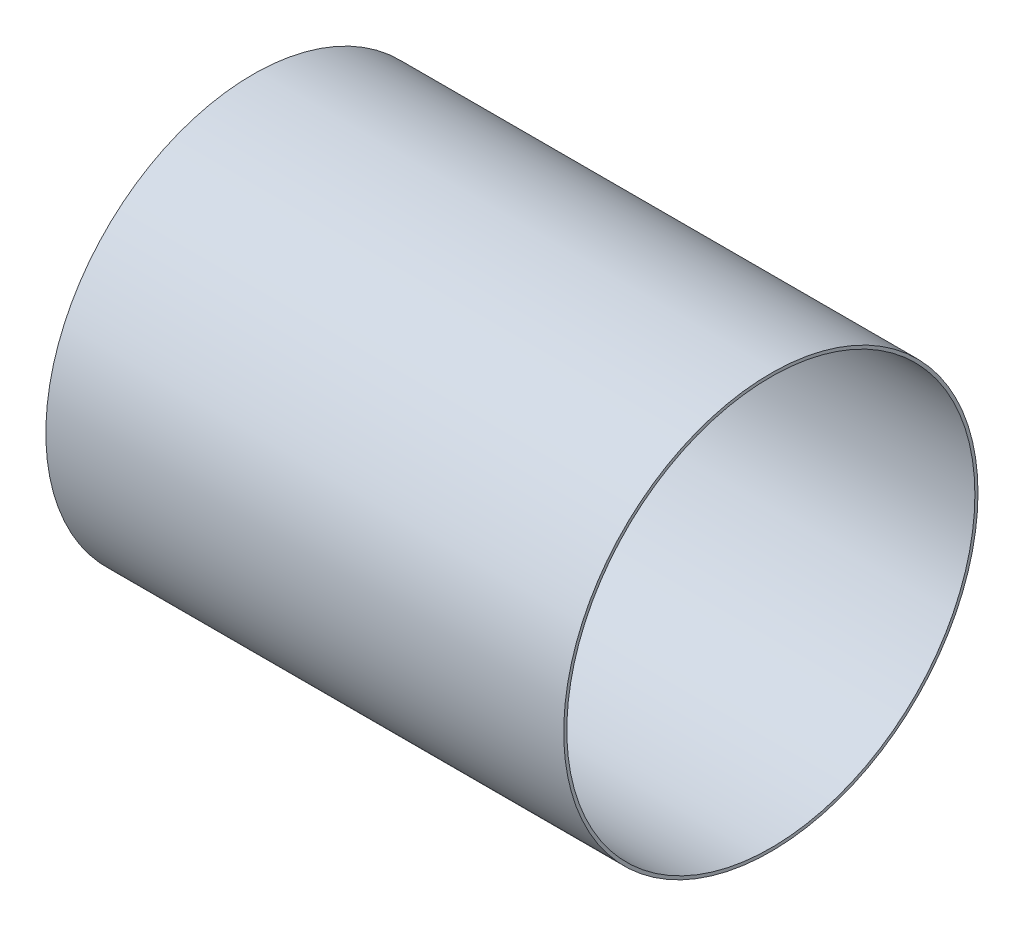
ISO-10303-21;
HEADER;
FILE_DESCRIPTION(('STEP AP214'),'2;1');
FILE_NAME('part.step','',(''),(''),'','','');
FILE_SCHEMA(('AUTOMOTIVE_DESIGN { 1 0 10303 214 1 1 1 1 }'));
ENDSEC;
DATA;
#1=APPLICATION_CONTEXT('core data for automotive mechanical design processes');
#2=APPLICATION_PROTOCOL_DEFINITION('international standard','automotive_design',2000,#1);
#3=PRODUCT_CONTEXT('',#1,'mechanical');
#4=PRODUCT('Part','Part','',(#3));
#5=PRODUCT_RELATED_PRODUCT_CATEGORY('part','',(#4));
#6=PRODUCT_DEFINITION_FORMATION('','',#4);
#7=PRODUCT_DEFINITION_CONTEXT('part definition',#1,'design');
#8=PRODUCT_DEFINITION('design','',#6,#7);
#9=PRODUCT_DEFINITION_SHAPE('','',#8);
#10=(LENGTH_UNIT() NAMED_UNIT(*) SI_UNIT(.MILLI.,.METRE.));
#11=(NAMED_UNIT(*) PLANE_ANGLE_UNIT() SI_UNIT($,.RADIAN.));
#12=(NAMED_UNIT(*) SI_UNIT($,.STERADIAN.) SOLID_ANGLE_UNIT());
#13=UNCERTAINTY_MEASURE_WITH_UNIT(LENGTH_MEASURE(1.E-05),#10,'distance_accuracy_value','');
#14=(GEOMETRIC_REPRESENTATION_CONTEXT(3) GLOBAL_UNCERTAINTY_ASSIGNED_CONTEXT((#13)) GLOBAL_UNIT_ASSIGNED_CONTEXT((#10,
#11,#12)) REPRESENTATION_CONTEXT('',''));
#15=CARTESIAN_POINT('',(0.,0.,0.));
#16=DIRECTION('',(0.,0.,1.));
#17=DIRECTION('',(1.,0.,0.));
#18=AXIS2_PLACEMENT_3D('',#15,#16,#17);
#19=CARTESIAN_POINT('',(500.,0.,0.));
#20=DIRECTION('',(1.,0.,0.));
#21=DIRECTION('',(0.,0.,-1.));
#22=AXIS2_PLACEMENT_3D('',#19,#20,#21);
#23=PLANE('',#22);
#24=CARTESIAN_POINT('',(500.,0.,0.));
#25=DIRECTION('',(1.,0.,0.));
#26=DIRECTION('',(0.,0.,-1.));
#27=AXIS2_PLACEMENT_3D('',#24,#25,#26);
#28=CIRCLE('',#27,200.);
#29=CARTESIAN_POINT('',(500.,0.,-200.));
#30=VERTEX_POINT('',#29);
#31=EDGE_CURVE('E10',#30,#30,#28,.T.);
#32=ORIENTED_EDGE('',*,*,#31,.T.);
#33=EDGE_LOOP('',(#32));
#34=FACE_BOUND('',#33,.T.);
#35=CARTESIAN_POINT('',(500.,0.,0.));
#36=DIRECTION('',(1.,0.,0.));
#37=DIRECTION('',(0.,0.,-1.));
#38=AXIS2_PLACEMENT_3D('',#35,#36,#37);
#39=CIRCLE('',#38,197.);
#40=CARTESIAN_POINT('',(500.,0.,-197.));
#41=VERTEX_POINT('',#40);
#42=EDGE_CURVE('E44',#41,#41,#39,.T.);
#43=ORIENTED_EDGE('',*,*,#42,.F.);
#44=EDGE_LOOP('',(#43));
#45=FACE_BOUND('',#44,.T.);
#46=ADVANCED_FACE('F33',(#34,#45),#23,.T.);
#47=CARTESIAN_POINT('',(0.,0.,0.));
#48=DIRECTION('',(1.,0.,0.));
#49=DIRECTION('',(0.,0.,-1.));
#50=AXIS2_PLACEMENT_3D('',#47,#48,#49);
#51=PLANE('',#50);
#52=CARTESIAN_POINT('',(0.,0.,0.));
#53=DIRECTION('',(1.,0.,0.));
#54=DIRECTION('',(0.,0.,-1.));
#55=AXIS2_PLACEMENT_3D('',#52,#53,#54);
#56=CIRCLE('',#55,200.);
#57=CARTESIAN_POINT('',(0.,0.,-200.));
#58=VERTEX_POINT('',#57);
#59=EDGE_CURVE('E37',#58,#58,#56,.T.);
#60=ORIENTED_EDGE('',*,*,#59,.F.);
#61=EDGE_LOOP('',(#60));
#62=FACE_BOUND('',#61,.T.);
#63=CARTESIAN_POINT('',(0.,0.,0.));
#64=DIRECTION('',(1.,0.,0.));
#65=DIRECTION('',(0.,0.,-1.));
#66=AXIS2_PLACEMENT_3D('',#63,#64,#65);
#67=CIRCLE('',#66,197.);
#68=CARTESIAN_POINT('',(0.,0.,-197.));
#69=VERTEX_POINT('',#68);
#70=EDGE_CURVE('E46',#69,#69,#67,.T.);
#71=ORIENTED_EDGE('',*,*,#70,.T.);
#72=EDGE_LOOP('',(#71));
#73=FACE_BOUND('',#72,.T.);
#74=ADVANCED_FACE('F56',(#62,#73),#51,.F.);
#75=CARTESIAN_POINT('',(500.,0.,0.));
#76=DIRECTION('',(-1.,0.,0.));
#77=DIRECTION('',(0.,0.,1.));
#78=AXIS2_PLACEMENT_3D('',#75,#76,#77);
#79=CYLINDRICAL_SURFACE('',#78,200.);
#80=ORIENTED_EDGE('',*,*,#31,.F.);
#81=EDGE_LOOP('',(#80));
#82=FACE_BOUND('',#81,.T.);
#83=ORIENTED_EDGE('',*,*,#59,.T.);
#84=EDGE_LOOP('',(#83));
#85=FACE_BOUND('',#84,.T.);
#86=ADVANCED_FACE('F35',(#82,#85),#79,.T.);
#87=CARTESIAN_POINT('',(500.,0.,0.));
#88=DIRECTION('',(-1.,0.,0.));
#89=DIRECTION('',(0.,0.,1.));
#90=AXIS2_PLACEMENT_3D('',#87,#88,#89);
#91=CYLINDRICAL_SURFACE('',#90,197.);
#92=ORIENTED_EDGE('',*,*,#42,.T.);
#93=EDGE_LOOP('',(#92));
#94=FACE_BOUND('',#93,.T.);
#95=ORIENTED_EDGE('',*,*,#70,.F.);
#96=EDGE_LOOP('',(#95));
#97=FACE_BOUND('',#96,.T.);
#98=ADVANCED_FACE('F52',(#94,#97),#91,.F.);
#99=CLOSED_SHELL('',(#46,#74,#86,#98));
#100=MANIFOLD_SOLID_BREP('B2',#99);
#101=ADVANCED_BREP_SHAPE_REPRESENTATION('',(#18,#100),#14);
#102=SHAPE_DEFINITION_REPRESENTATION(#9,#101);
ENDSEC;
END-ISO-10303-21;
